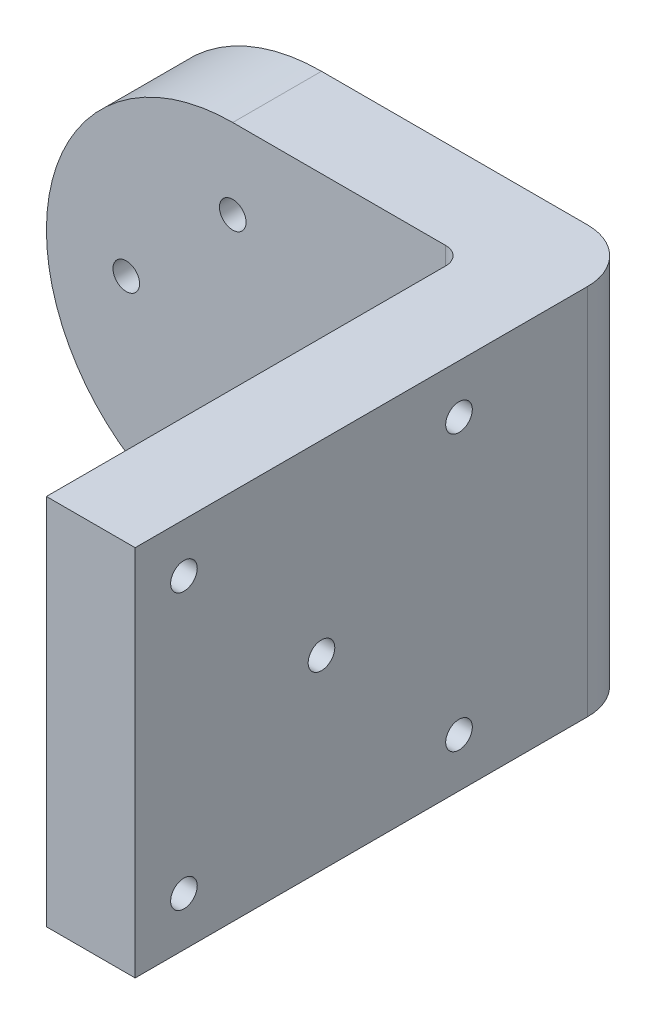
ISO-10303-21;
HEADER;
FILE_DESCRIPTION(('STEP AP214'),'2;1');
FILE_NAME('part.step','',(''),(''),'','','');
FILE_SCHEMA(('AUTOMOTIVE_DESIGN { 1 0 10303 214 1 1 1 1 }'));
ENDSEC;
DATA;
#1=APPLICATION_CONTEXT('core data for automotive mechanical design processes');
#2=APPLICATION_PROTOCOL_DEFINITION('international standard','automotive_design',2000,#1);
#3=PRODUCT_CONTEXT('',#1,'mechanical');
#4=PRODUCT('Part','Part','',(#3));
#5=PRODUCT_RELATED_PRODUCT_CATEGORY('part','',(#4));
#6=PRODUCT_DEFINITION_FORMATION('','',#4);
#7=PRODUCT_DEFINITION_CONTEXT('part definition',#1,'design');
#8=PRODUCT_DEFINITION('design','',#6,#7);
#9=PRODUCT_DEFINITION_SHAPE('','',#8);
#10=(LENGTH_UNIT() NAMED_UNIT(*) SI_UNIT(.MILLI.,.METRE.));
#11=(NAMED_UNIT(*) PLANE_ANGLE_UNIT() SI_UNIT($,.RADIAN.));
#12=(NAMED_UNIT(*) SI_UNIT($,.STERADIAN.) SOLID_ANGLE_UNIT());
#13=UNCERTAINTY_MEASURE_WITH_UNIT(LENGTH_MEASURE(1.E-05),#10,'distance_accuracy_value','');
#14=(GEOMETRIC_REPRESENTATION_CONTEXT(3) GLOBAL_UNCERTAINTY_ASSIGNED_CONTEXT((#13)) GLOBAL_UNIT_ASSIGNED_CONTEXT((#10,
#11,#12)) REPRESENTATION_CONTEXT('',''));
#15=CARTESIAN_POINT('',(0.,0.,0.));
#16=DIRECTION('',(0.,0.,1.));
#17=DIRECTION('',(1.,0.,0.));
#18=AXIS2_PLACEMENT_3D('',#15,#16,#17);
#19=CARTESIAN_POINT('',(0.,0.,10.));
#20=DIRECTION('',(0.,0.,-1.));
#21=DIRECTION('',(-1.,0.,0.));
#22=AXIS2_PLACEMENT_3D('',#19,#20,#21);
#23=CYLINDRICAL_SURFACE('',#22,21.);
#24=CARTESIAN_POINT('',(0.,0.,0.));
#25=DIRECTION('',(0.,0.,1.));
#26=DIRECTION('',(1.,0.,0.));
#27=AXIS2_PLACEMENT_3D('',#24,#25,#26);
#28=CIRCLE('',#27,21.);
#29=CARTESIAN_POINT('',(0.,21.,0.));
#30=VERTEX_POINT('',#29);
#31=CARTESIAN_POINT('',(0.,-21.,0.));
#32=VERTEX_POINT('',#31);
#33=EDGE_CURVE('E237',#30,#32,#28,.T.);
#34=ORIENTED_EDGE('',*,*,#33,.T.);
#35=DIRECTION('',(0.,0.,-1.));
#36=VECTOR('',#35,1.);
#37=CARTESIAN_POINT('',(0.,-21.,10.));
#38=LINE('',#37,#36);
#39=CARTESIAN_POINT('',(0.,-21.,10.));
#40=VERTEX_POINT('',#39);
#41=EDGE_CURVE('E248',#40,#32,#38,.T.);
#42=ORIENTED_EDGE('',*,*,#41,.F.);
#43=CARTESIAN_POINT('',(0.,0.,10.));
#44=DIRECTION('',(0.,0.,1.));
#45=DIRECTION('',(1.,0.,0.));
#46=AXIS2_PLACEMENT_3D('',#43,#44,#45);
#47=CIRCLE('',#46,21.);
#48=CARTESIAN_POINT('',(0.,21.,10.));
#49=VERTEX_POINT('',#48);
#50=EDGE_CURVE('E213',#49,#40,#47,.T.);
#51=ORIENTED_EDGE('',*,*,#50,.F.);
#52=DIRECTION('',(0.,0.,-1.));
#53=VECTOR('',#52,1.);
#54=CARTESIAN_POINT('',(0.,21.,10.));
#55=LINE('',#54,#53);
#56=EDGE_CURVE('E224',#49,#30,#55,.T.);
#57=ORIENTED_EDGE('',*,*,#56,.T.);
#58=EDGE_LOOP('',(#34,#42,#51,#57));
#59=FACE_BOUND('',#58,.T.);
#60=ADVANCED_FACE('F91',(#59),#23,.T.);
#61=CARTESIAN_POINT('',(0.,-21.,10.));
#62=DIRECTION('',(0.,1.,0.));
#63=DIRECTION('',(-1.,0.,0.));
#64=AXIS2_PLACEMENT_3D('',#61,#62,#63);
#65=PLANE('',#64);
#66=DIRECTION('',(1.,0.,0.));
#67=VECTOR('',#66,1.);
#68=CARTESIAN_POINT('',(0.,-21.,0.));
#69=LINE('',#68,#67);
#70=CARTESIAN_POINT('',(30.,-21.,0.));
#71=VERTEX_POINT('',#70);
#72=EDGE_CURVE('E241',#32,#71,#69,.T.);
#73=ORIENTED_EDGE('',*,*,#72,.T.);
#74=CARTESIAN_POINT('',(30.,-21.,6.));
#75=DIRECTION('',(0.,1.,0.));
#76=DIRECTION('',(-1.,0.,0.));
#77=AXIS2_PLACEMENT_3D('',#74,#75,#76);
#78=CIRCLE('',#77,6.);
#79=CARTESIAN_POINT('',(36.,-21.,6.));
#80=VERTEX_POINT('',#79);
#81=EDGE_CURVE('E12',#71,#80,#78,.F.);
#82=ORIENTED_EDGE('',*,*,#81,.T.);
#83=DIRECTION('',(0.,0.,1.));
#84=VECTOR('',#83,1.);
#85=CARTESIAN_POINT('',(36.,-21.,0.));
#86=LINE('',#85,#84);
#87=CARTESIAN_POINT('',(36.,-21.,57.));
#88=VERTEX_POINT('',#87);
#89=EDGE_CURVE('E156',#80,#88,#86,.T.);
#90=ORIENTED_EDGE('',*,*,#89,.T.);
#91=DIRECTION('',(-1.,0.,0.));
#92=VECTOR('',#91,1.);
#93=CARTESIAN_POINT('',(36.,-21.,57.));
#94=LINE('',#93,#92);
#95=CARTESIAN_POINT('',(26.,-21.,57.));
#96=VERTEX_POINT('',#95);
#97=EDGE_CURVE('E161',#88,#96,#94,.T.);
#98=ORIENTED_EDGE('',*,*,#97,.T.);
#99=DIRECTION('',(0.,0.,1.));
#100=VECTOR('',#99,1.);
#101=CARTESIAN_POINT('',(26.,-21.,0.));
#102=LINE('',#101,#100);
#103=CARTESIAN_POINT('',(26.,-21.,12.));
#104=VERTEX_POINT('',#103);
#105=EDGE_CURVE('E296',#104,#96,#102,.T.);
#106=ORIENTED_EDGE('',*,*,#105,.F.);
#107=CARTESIAN_POINT('',(24.,-21.,12.));
#108=DIRECTION('',(0.,1.,0.));
#109=DIRECTION('',(-1.,0.,0.));
#110=AXIS2_PLACEMENT_3D('',#107,#108,#109);
#111=CIRCLE('',#110,2.);
#112=CARTESIAN_POINT('',(24.,-21.,10.));
#113=VERTEX_POINT('',#112);
#114=EDGE_CURVE('E259',#104,#113,#111,.T.);
#115=ORIENTED_EDGE('',*,*,#114,.T.);
#116=DIRECTION('',(1.,0.,0.));
#117=VECTOR('',#116,1.);
#118=CARTESIAN_POINT('',(0.,-21.,10.));
#119=LINE('',#118,#117);
#120=EDGE_CURVE('E217',#40,#113,#119,.T.);
#121=ORIENTED_EDGE('',*,*,#120,.F.);
#122=ORIENTED_EDGE('',*,*,#41,.T.);
#123=EDGE_LOOP('',(#73,#82,#90,#98,#106,#115,#121,#122));
#124=FACE_BOUND('',#123,.T.);
#125=ADVANCED_FACE('F158',(#124),#65,.F.);
#126=CARTESIAN_POINT('',(-12.,0.,10.));
#127=DIRECTION('',(0.,0.,-1.));
#128=DIRECTION('',(-1.,0.,0.));
#129=AXIS2_PLACEMENT_3D('',#126,#127,#128);
#130=CYLINDRICAL_SURFACE('',#129,1.5);
#131=CARTESIAN_POINT('',(-12.,0.,10.));
#132=DIRECTION('',(0.,0.,1.));
#133=DIRECTION('',(1.,0.,0.));
#134=AXIS2_PLACEMENT_3D('',#131,#132,#133);
#135=CIRCLE('',#134,1.5);
#136=CARTESIAN_POINT('',(-10.5,0.,10.));
#137=VERTEX_POINT('',#136);
#138=EDGE_CURVE('E209',#137,#137,#135,.T.);
#139=ORIENTED_EDGE('',*,*,#138,.T.);
#140=EDGE_LOOP('',(#139));
#141=FACE_BOUND('',#140,.T.);
#142=CARTESIAN_POINT('',(-12.,0.,0.));
#143=DIRECTION('',(0.,0.,1.));
#144=DIRECTION('',(1.,0.,0.));
#145=AXIS2_PLACEMENT_3D('',#142,#143,#144);
#146=CIRCLE('',#145,1.5);
#147=CARTESIAN_POINT('',(-10.5,0.,0.));
#148=VERTEX_POINT('',#147);
#149=EDGE_CURVE('E233',#148,#148,#146,.T.);
#150=ORIENTED_EDGE('',*,*,#149,.F.);
#151=EDGE_LOOP('',(#150));
#152=FACE_BOUND('',#151,.T.);
#153=ADVANCED_FACE('F344',(#141,#152),#130,.F.);
#154=CARTESIAN_POINT('',(12.,0.,10.));
#155=DIRECTION('',(0.,0.,-1.));
#156=DIRECTION('',(-1.,0.,0.));
#157=AXIS2_PLACEMENT_3D('',#154,#155,#156);
#158=CYLINDRICAL_SURFACE('',#157,1.5);
#159=CARTESIAN_POINT('',(12.,0.,10.));
#160=DIRECTION('',(0.,0.,1.));
#161=DIRECTION('',(1.,0.,0.));
#162=AXIS2_PLACEMENT_3D('',#159,#160,#161);
#163=CIRCLE('',#162,1.5);
#164=CARTESIAN_POINT('',(13.5,0.,10.));
#165=VERTEX_POINT('',#164);
#166=EDGE_CURVE('E205',#165,#165,#163,.T.);
#167=ORIENTED_EDGE('',*,*,#166,.T.);
#168=EDGE_LOOP('',(#167));
#169=FACE_BOUND('',#168,.T.);
#170=CARTESIAN_POINT('',(12.,0.,0.));
#171=DIRECTION('',(0.,0.,1.));
#172=DIRECTION('',(1.,0.,0.));
#173=AXIS2_PLACEMENT_3D('',#170,#171,#172);
#174=CIRCLE('',#173,1.5);
#175=CARTESIAN_POINT('',(13.5,0.,0.));
#176=VERTEX_POINT('',#175);
#177=EDGE_CURVE('E229',#176,#176,#174,.T.);
#178=ORIENTED_EDGE('',*,*,#177,.F.);
#179=EDGE_LOOP('',(#178));
#180=FACE_BOUND('',#179,.T.);
#181=ADVANCED_FACE('F350',(#169,#180),#158,.F.);
#182=CARTESIAN_POINT('',(0.,12.,10.));
#183=DIRECTION('',(0.,0.,-1.));
#184=DIRECTION('',(-1.,0.,0.));
#185=AXIS2_PLACEMENT_3D('',#182,#183,#184);
#186=CYLINDRICAL_SURFACE('',#185,1.5);
#187=CARTESIAN_POINT('',(0.,12.,10.));
#188=DIRECTION('',(0.,0.,1.));
#189=DIRECTION('',(1.,0.,0.));
#190=AXIS2_PLACEMENT_3D('',#187,#188,#189);
#191=CIRCLE('',#190,1.5);
#192=CARTESIAN_POINT('',(1.5,12.,10.));
#193=VERTEX_POINT('',#192);
#194=EDGE_CURVE('E200',#193,#193,#191,.T.);
#195=ORIENTED_EDGE('',*,*,#194,.T.);
#196=EDGE_LOOP('',(#195));
#197=FACE_BOUND('',#196,.T.);
#198=CARTESIAN_POINT('',(0.,12.,0.));
#199=DIRECTION('',(0.,0.,1.));
#200=DIRECTION('',(1.,0.,0.));
#201=AXIS2_PLACEMENT_3D('',#198,#199,#200);
#202=CIRCLE('',#201,1.5);
#203=CARTESIAN_POINT('',(1.5,12.,0.));
#204=VERTEX_POINT('',#203);
#205=EDGE_CURVE('E190',#204,#204,#202,.T.);
#206=ORIENTED_EDGE('',*,*,#205,.F.);
#207=EDGE_LOOP('',(#206));
#208=FACE_BOUND('',#207,.T.);
#209=ADVANCED_FACE('F354',(#197,#208),#186,.F.);
#210=CARTESIAN_POINT('',(0.,-12.,10.));
#211=DIRECTION('',(0.,0.,-1.));
#212=DIRECTION('',(-1.,0.,0.));
#213=AXIS2_PLACEMENT_3D('',#210,#211,#212);
#214=CYLINDRICAL_SURFACE('',#213,1.5);
#215=CARTESIAN_POINT('',(0.,-12.,10.));
#216=DIRECTION('',(0.,0.,1.));
#217=DIRECTION('',(1.,0.,0.));
#218=AXIS2_PLACEMENT_3D('',#215,#216,#217);
#219=CIRCLE('',#218,1.5);
#220=CARTESIAN_POINT('',(1.5,-12.,10.));
#221=VERTEX_POINT('',#220);
#222=EDGE_CURVE('E196',#221,#221,#219,.T.);
#223=ORIENTED_EDGE('',*,*,#222,.T.);
#224=EDGE_LOOP('',(#223));
#225=FACE_BOUND('',#224,.T.);
#226=CARTESIAN_POINT('',(0.,-12.,0.));
#227=DIRECTION('',(0.,0.,1.));
#228=DIRECTION('',(1.,0.,0.));
#229=AXIS2_PLACEMENT_3D('',#226,#227,#228);
#230=CIRCLE('',#229,1.5);
#231=CARTESIAN_POINT('',(1.5,-12.,0.));
#232=VERTEX_POINT('',#231);
#233=EDGE_CURVE('E184',#232,#232,#230,.T.);
#234=ORIENTED_EDGE('',*,*,#233,.F.);
#235=EDGE_LOOP('',(#234));
#236=FACE_BOUND('',#235,.T.);
#237=ADVANCED_FACE('F358',(#225,#236),#214,.F.);
#238=CARTESIAN_POINT('',(0.,21.,10.));
#239=DIRECTION('',(0.,1.,0.));
#240=DIRECTION('',(-1.,0.,0.));
#241=AXIS2_PLACEMENT_3D('',#238,#239,#240);
#242=PLANE('',#241);
#243=DIRECTION('',(0.,0.,1.));
#244=VECTOR('',#243,1.);
#245=CARTESIAN_POINT('',(36.,21.,0.));
#246=LINE('',#245,#244);
#247=CARTESIAN_POINT('',(36.,21.,6.));
#248=VERTEX_POINT('',#247);
#249=CARTESIAN_POINT('',(36.,21.,57.));
#250=VERTEX_POINT('',#249);
#251=EDGE_CURVE('E168',#248,#250,#246,.T.);
#252=ORIENTED_EDGE('',*,*,#251,.F.);
#253=CARTESIAN_POINT('',(30.,21.,6.));
#254=DIRECTION('',(0.,1.,0.));
#255=DIRECTION('',(-1.,0.,0.));
#256=AXIS2_PLACEMENT_3D('',#253,#254,#255);
#257=CIRCLE('',#256,6.);
#258=CARTESIAN_POINT('',(30.,21.,0.));
#259=VERTEX_POINT('',#258);
#260=EDGE_CURVE('E114',#248,#259,#257,.T.);
#261=ORIENTED_EDGE('',*,*,#260,.T.);
#262=DIRECTION('',(1.,0.,0.));
#263=VECTOR('',#262,1.);
#264=CARTESIAN_POINT('',(0.,21.,0.));
#265=LINE('',#264,#263);
#266=EDGE_CURVE('E201',#30,#259,#265,.T.);
#267=ORIENTED_EDGE('',*,*,#266,.F.);
#268=ORIENTED_EDGE('',*,*,#56,.F.);
#269=DIRECTION('',(1.,0.,0.));
#270=VECTOR('',#269,1.);
#271=CARTESIAN_POINT('',(0.,21.,10.));
#272=LINE('',#271,#270);
#273=CARTESIAN_POINT('',(24.,21.,10.));
#274=VERTEX_POINT('',#273);
#275=EDGE_CURVE('E221',#49,#274,#272,.T.);
#276=ORIENTED_EDGE('',*,*,#275,.T.);
#277=CARTESIAN_POINT('',(24.,21.,12.));
#278=DIRECTION('',(0.,1.,0.));
#279=DIRECTION('',(-1.,0.,0.));
#280=AXIS2_PLACEMENT_3D('',#277,#278,#279);
#281=CIRCLE('',#280,2.);
#282=CARTESIAN_POINT('',(26.,21.,12.));
#283=VERTEX_POINT('',#282);
#284=EDGE_CURVE('E262',#274,#283,#281,.F.);
#285=ORIENTED_EDGE('',*,*,#284,.T.);
#286=DIRECTION('',(0.,0.,1.));
#287=VECTOR('',#286,1.);
#288=CARTESIAN_POINT('',(26.,21.,0.));
#289=LINE('',#288,#287);
#290=CARTESIAN_POINT('',(26.,21.,57.));
#291=VERTEX_POINT('',#290);
#292=EDGE_CURVE('E299',#283,#291,#289,.T.);
#293=ORIENTED_EDGE('',*,*,#292,.T.);
#294=DIRECTION('',(-1.,0.,0.));
#295=VECTOR('',#294,1.);
#296=CARTESIAN_POINT('',(36.,21.,57.));
#297=LINE('',#296,#295);
#298=EDGE_CURVE('E185',#250,#291,#297,.T.);
#299=ORIENTED_EDGE('',*,*,#298,.F.);
#300=EDGE_LOOP('',(#252,#261,#267,#268,#276,#285,#293,#299));
#301=FACE_BOUND('',#300,.T.);
#302=ADVANCED_FACE('F271',(#301),#242,.T.);
#303=CARTESIAN_POINT('',(0.,0.,10.));
#304=DIRECTION('',(0.,0.,1.));
#305=DIRECTION('',(1.,0.,0.));
#306=AXIS2_PLACEMENT_3D('',#303,#304,#305);
#307=PLANE('',#306);
#308=ORIENTED_EDGE('',*,*,#222,.F.);
#309=EDGE_LOOP('',(#308));
#310=FACE_BOUND('',#309,.T.);
#311=ORIENTED_EDGE('',*,*,#194,.F.);
#312=EDGE_LOOP('',(#311));
#313=FACE_BOUND('',#312,.T.);
#314=ORIENTED_EDGE('',*,*,#166,.F.);
#315=EDGE_LOOP('',(#314));
#316=FACE_BOUND('',#315,.T.);
#317=ORIENTED_EDGE('',*,*,#138,.F.);
#318=EDGE_LOOP('',(#317));
#319=FACE_BOUND('',#318,.T.);
#320=ORIENTED_EDGE('',*,*,#120,.T.);
#321=DIRECTION('',(0.,-1.,0.));
#322=VECTOR('',#321,1.);
#323=CARTESIAN_POINT('',(24.,0.,10.));
#324=LINE('',#323,#322);
#325=EDGE_CURVE('E256',#113,#274,#324,.F.);
#326=ORIENTED_EDGE('',*,*,#325,.T.);
#327=ORIENTED_EDGE('',*,*,#275,.F.);
#328=ORIENTED_EDGE('',*,*,#50,.T.);
#329=EDGE_LOOP('',(#320,#326,#327,#328));
#330=FACE_BOUND('',#329,.T.);
#331=ADVANCED_FACE('F365',(#310,#313,#316,#319,#330),#307,.T.);
#332=CARTESIAN_POINT('',(0.,0.,0.));
#333=DIRECTION('',(0.,0.,1.));
#334=DIRECTION('',(1.,0.,0.));
#335=AXIS2_PLACEMENT_3D('',#332,#333,#334);
#336=PLANE('',#335);
#337=ORIENTED_EDGE('',*,*,#233,.T.);
#338=EDGE_LOOP('',(#337));
#339=FACE_BOUND('',#338,.T.);
#340=ORIENTED_EDGE('',*,*,#205,.T.);
#341=EDGE_LOOP('',(#340));
#342=FACE_BOUND('',#341,.T.);
#343=ORIENTED_EDGE('',*,*,#177,.T.);
#344=EDGE_LOOP('',(#343));
#345=FACE_BOUND('',#344,.T.);
#346=ORIENTED_EDGE('',*,*,#149,.T.);
#347=EDGE_LOOP('',(#346));
#348=FACE_BOUND('',#347,.T.);
#349=ORIENTED_EDGE('',*,*,#266,.T.);
#350=DIRECTION('',(0.,1.,0.));
#351=VECTOR('',#350,1.);
#352=CARTESIAN_POINT('',(30.,-21.,0.));
#353=LINE('',#352,#351);
#354=EDGE_CURVE('E100',#259,#71,#353,.F.);
#355=ORIENTED_EDGE('',*,*,#354,.T.);
#356=ORIENTED_EDGE('',*,*,#72,.F.);
#357=ORIENTED_EDGE('',*,*,#33,.F.);
#358=EDGE_LOOP('',(#349,#355,#356,#357));
#359=FACE_BOUND('',#358,.T.);
#360=ADVANCED_FACE('F370',(#339,#342,#345,#348,#359),#336,.F.);
#361=CARTESIAN_POINT('',(26.,0.,0.));
#362=DIRECTION('',(1.,0.,0.));
#363=DIRECTION('',(0.,0.,-1.));
#364=AXIS2_PLACEMENT_3D('',#361,#362,#363);
#365=PLANE('',#364);
#366=CARTESIAN_POINT('',(26.,-15.5,51.5));
#367=DIRECTION('',(1.,0.,0.));
#368=DIRECTION('',(0.,0.,-1.));
#369=AXIS2_PLACEMENT_3D('',#366,#367,#368);
#370=CIRCLE('',#369,1.5);
#371=CARTESIAN_POINT('',(26.,-15.5,50.));
#372=VERTEX_POINT('',#371);
#373=EDGE_CURVE('E290',#372,#372,#370,.T.);
#374=ORIENTED_EDGE('',*,*,#373,.T.);
#375=EDGE_LOOP('',(#374));
#376=FACE_BOUND('',#375,.T.);
#377=CARTESIAN_POINT('',(26.,0.,36.));
#378=DIRECTION('',(1.,0.,0.));
#379=DIRECTION('',(0.,0.,-1.));
#380=AXIS2_PLACEMENT_3D('',#377,#378,#379);
#381=CIRCLE('',#380,1.5);
#382=CARTESIAN_POINT('',(26.,0.,34.5));
#383=VERTEX_POINT('',#382);
#384=EDGE_CURVE('E302',#383,#383,#381,.T.);
#385=ORIENTED_EDGE('',*,*,#384,.T.);
#386=EDGE_LOOP('',(#385));
#387=FACE_BOUND('',#386,.T.);
#388=CARTESIAN_POINT('',(26.,15.5,20.5));
#389=DIRECTION('',(1.,0.,0.));
#390=DIRECTION('',(0.,0.,-1.));
#391=AXIS2_PLACEMENT_3D('',#388,#389,#390);
#392=CIRCLE('',#391,1.5);
#393=CARTESIAN_POINT('',(26.,15.5,19.));
#394=VERTEX_POINT('',#393);
#395=EDGE_CURVE('E306',#394,#394,#392,.T.);
#396=ORIENTED_EDGE('',*,*,#395,.T.);
#397=EDGE_LOOP('',(#396));
#398=FACE_BOUND('',#397,.T.);
#399=CARTESIAN_POINT('',(26.,15.5,51.5));
#400=DIRECTION('',(1.,0.,0.));
#401=DIRECTION('',(0.,0.,-1.));
#402=AXIS2_PLACEMENT_3D('',#399,#400,#401);
#403=CIRCLE('',#402,1.5);
#404=CARTESIAN_POINT('',(26.,15.5,50.));
#405=VERTEX_POINT('',#404);
#406=EDGE_CURVE('E310',#405,#405,#403,.T.);
#407=ORIENTED_EDGE('',*,*,#406,.T.);
#408=EDGE_LOOP('',(#407));
#409=FACE_BOUND('',#408,.T.);
#410=CARTESIAN_POINT('',(26.,-15.5,20.5));
#411=DIRECTION('',(1.,0.,0.));
#412=DIRECTION('',(0.,0.,-1.));
#413=AXIS2_PLACEMENT_3D('',#410,#411,#412);
#414=CIRCLE('',#413,1.5);
#415=CARTESIAN_POINT('',(26.,-15.5,19.));
#416=VERTEX_POINT('',#415);
#417=EDGE_CURVE('E313',#416,#416,#414,.T.);
#418=ORIENTED_EDGE('',*,*,#417,.T.);
#419=EDGE_LOOP('',(#418));
#420=FACE_BOUND('',#419,.T.);
#421=ORIENTED_EDGE('',*,*,#292,.F.);
#422=DIRECTION('',(0.,-1.,0.));
#423=VECTOR('',#422,1.);
#424=CARTESIAN_POINT('',(26.,0.,12.));
#425=LINE('',#424,#423);
#426=EDGE_CURVE('E252',#283,#104,#425,.T.);
#427=ORIENTED_EDGE('',*,*,#426,.T.);
#428=ORIENTED_EDGE('',*,*,#105,.T.);
#429=DIRECTION('',(0.,-1.,0.));
#430=VECTOR('',#429,1.);
#431=CARTESIAN_POINT('',(26.,0.,57.));
#432=LINE('',#431,#430);
#433=EDGE_CURVE('E182',#291,#96,#432,.T.);
#434=ORIENTED_EDGE('',*,*,#433,.F.);
#435=EDGE_LOOP('',(#421,#427,#428,#434));
#436=FACE_BOUND('',#435,.T.);
#437=ADVANCED_FACE('F373',(#376,#387,#398,#409,#420,#436),#365,.F.);
#438=CARTESIAN_POINT('',(36.,0.,57.));
#439=DIRECTION('',(0.,0.,-1.));
#440=DIRECTION('',(-1.,0.,0.));
#441=AXIS2_PLACEMENT_3D('',#438,#439,#440);
#442=PLANE('',#441);
#443=ORIENTED_EDGE('',*,*,#433,.T.);
#444=ORIENTED_EDGE('',*,*,#97,.F.);
#445=DIRECTION('',(0.,-1.,0.));
#446=VECTOR('',#445,1.);
#447=CARTESIAN_POINT('',(36.,0.,57.));
#448=LINE('',#447,#446);
#449=EDGE_CURVE('E169',#250,#88,#448,.T.);
#450=ORIENTED_EDGE('',*,*,#449,.F.);
#451=ORIENTED_EDGE('',*,*,#298,.T.);
#452=EDGE_LOOP('',(#443,#444,#450,#451));
#453=FACE_BOUND('',#452,.T.);
#454=ADVANCED_FACE('F180',(#453),#442,.F.);
#455=CARTESIAN_POINT('',(36.,15.5,51.5));
#456=DIRECTION('',(-1.,0.,0.));
#457=DIRECTION('',(0.,0.,1.));
#458=AXIS2_PLACEMENT_3D('',#455,#456,#457);
#459=CYLINDRICAL_SURFACE('',#458,1.5);
#460=CARTESIAN_POINT('',(36.,15.5,51.5));
#461=DIRECTION('',(1.,0.,0.));
#462=DIRECTION('',(0.,0.,-1.));
#463=AXIS2_PLACEMENT_3D('',#460,#461,#462);
#464=CIRCLE('',#463,1.5);
#465=CARTESIAN_POINT('',(36.,15.5,50.));
#466=VERTEX_POINT('',#465);
#467=EDGE_CURVE('E283',#466,#466,#464,.T.);
#468=ORIENTED_EDGE('',*,*,#467,.T.);
#469=EDGE_LOOP('',(#468));
#470=FACE_BOUND('',#469,.T.);
#471=ORIENTED_EDGE('',*,*,#406,.F.);
#472=EDGE_LOOP('',(#471));
#473=FACE_BOUND('',#472,.T.);
#474=ADVANCED_FACE('F468',(#470,#473),#459,.F.);
#475=CARTESIAN_POINT('',(36.,15.5,20.5));
#476=DIRECTION('',(-1.,0.,0.));
#477=DIRECTION('',(0.,0.,1.));
#478=AXIS2_PLACEMENT_3D('',#475,#476,#477);
#479=CYLINDRICAL_SURFACE('',#478,1.5);
#480=CARTESIAN_POINT('',(36.,15.5,20.5));
#481=DIRECTION('',(1.,0.,0.));
#482=DIRECTION('',(0.,0.,-1.));
#483=AXIS2_PLACEMENT_3D('',#480,#481,#482);
#484=CIRCLE('',#483,1.5);
#485=CARTESIAN_POINT('',(36.,15.5,19.));
#486=VERTEX_POINT('',#485);
#487=EDGE_CURVE('E277',#486,#486,#484,.T.);
#488=ORIENTED_EDGE('',*,*,#487,.T.);
#489=EDGE_LOOP('',(#488));
#490=FACE_BOUND('',#489,.T.);
#491=ORIENTED_EDGE('',*,*,#395,.F.);
#492=EDGE_LOOP('',(#491));
#493=FACE_BOUND('',#492,.T.);
#494=ADVANCED_FACE('F459',(#490,#493),#479,.F.);
#495=CARTESIAN_POINT('',(36.,0.,36.));
#496=DIRECTION('',(-1.,0.,0.));
#497=DIRECTION('',(0.,0.,1.));
#498=AXIS2_PLACEMENT_3D('',#495,#496,#497);
#499=CYLINDRICAL_SURFACE('',#498,1.5);
#500=CARTESIAN_POINT('',(36.,0.,36.));
#501=DIRECTION('',(1.,0.,0.));
#502=DIRECTION('',(0.,0.,-1.));
#503=AXIS2_PLACEMENT_3D('',#500,#501,#502);
#504=CIRCLE('',#503,1.5);
#505=CARTESIAN_POINT('',(36.,0.,34.5));
#506=VERTEX_POINT('',#505);
#507=EDGE_CURVE('E273',#506,#506,#504,.T.);
#508=ORIENTED_EDGE('',*,*,#507,.T.);
#509=EDGE_LOOP('',(#508));
#510=FACE_BOUND('',#509,.T.);
#511=ORIENTED_EDGE('',*,*,#384,.F.);
#512=EDGE_LOOP('',(#511));
#513=FACE_BOUND('',#512,.T.);
#514=ADVANCED_FACE('F451',(#510,#513),#499,.F.);
#515=CARTESIAN_POINT('',(36.,-15.5,51.5));
#516=DIRECTION('',(-1.,0.,0.));
#517=DIRECTION('',(0.,0.,1.));
#518=AXIS2_PLACEMENT_3D('',#515,#516,#517);
#519=CYLINDRICAL_SURFACE('',#518,1.5);
#520=CARTESIAN_POINT('',(36.,-15.5,51.5));
#521=DIRECTION('',(1.,0.,0.));
#522=DIRECTION('',(0.,0.,-1.));
#523=AXIS2_PLACEMENT_3D('',#520,#521,#522);
#524=CIRCLE('',#523,1.5);
#525=CARTESIAN_POINT('',(36.,-15.5,50.));
#526=VERTEX_POINT('',#525);
#527=EDGE_CURVE('E178',#526,#526,#524,.T.);
#528=ORIENTED_EDGE('',*,*,#527,.T.);
#529=EDGE_LOOP('',(#528));
#530=FACE_BOUND('',#529,.T.);
#531=ORIENTED_EDGE('',*,*,#373,.F.);
#532=EDGE_LOOP('',(#531));
#533=FACE_BOUND('',#532,.T.);
#534=ADVANCED_FACE('F323',(#530,#533),#519,.F.);
#535=CARTESIAN_POINT('',(36.,-15.5,20.5));
#536=DIRECTION('',(-1.,0.,0.));
#537=DIRECTION('',(0.,0.,1.));
#538=AXIS2_PLACEMENT_3D('',#535,#536,#537);
#539=CYLINDRICAL_SURFACE('',#538,1.5);
#540=CARTESIAN_POINT('',(36.,-15.5,20.5));
#541=DIRECTION('',(1.,0.,0.));
#542=DIRECTION('',(0.,0.,-1.));
#543=AXIS2_PLACEMENT_3D('',#540,#541,#542);
#544=CIRCLE('',#543,1.5);
#545=CARTESIAN_POINT('',(36.,-15.5,19.));
#546=VERTEX_POINT('',#545);
#547=EDGE_CURVE('E192',#546,#546,#544,.T.);
#548=ORIENTED_EDGE('',*,*,#547,.T.);
#549=EDGE_LOOP('',(#548));
#550=FACE_BOUND('',#549,.T.);
#551=ORIENTED_EDGE('',*,*,#417,.F.);
#552=EDGE_LOOP('',(#551));
#553=FACE_BOUND('',#552,.T.);
#554=ADVANCED_FACE('F328',(#550,#553),#539,.F.);
#555=CARTESIAN_POINT('',(36.,0.,0.));
#556=DIRECTION('',(1.,0.,0.));
#557=DIRECTION('',(0.,0.,-1.));
#558=AXIS2_PLACEMENT_3D('',#555,#556,#557);
#559=PLANE('',#558);
#560=ORIENTED_EDGE('',*,*,#527,.F.);
#561=EDGE_LOOP('',(#560));
#562=FACE_BOUND('',#561,.T.);
#563=ORIENTED_EDGE('',*,*,#89,.F.);
#564=DIRECTION('',(0.,1.,0.));
#565=VECTOR('',#564,1.);
#566=CARTESIAN_POINT('',(36.,21.,6.));
#567=LINE('',#566,#565);
#568=EDGE_CURVE('E265',#80,#248,#567,.T.);
#569=ORIENTED_EDGE('',*,*,#568,.T.);
#570=ORIENTED_EDGE('',*,*,#251,.T.);
#571=ORIENTED_EDGE('',*,*,#449,.T.);
#572=EDGE_LOOP('',(#563,#569,#570,#571));
#573=FACE_BOUND('',#572,.T.);
#574=ORIENTED_EDGE('',*,*,#507,.F.);
#575=EDGE_LOOP('',(#574));
#576=FACE_BOUND('',#575,.T.);
#577=ORIENTED_EDGE('',*,*,#487,.F.);
#578=EDGE_LOOP('',(#577));
#579=FACE_BOUND('',#578,.T.);
#580=ORIENTED_EDGE('',*,*,#467,.F.);
#581=EDGE_LOOP('',(#580));
#582=FACE_BOUND('',#581,.T.);
#583=ORIENTED_EDGE('',*,*,#547,.F.);
#584=EDGE_LOOP('',(#583));
#585=FACE_BOUND('',#584,.T.);
#586=ADVANCED_FACE('F172',(#562,#573,#576,#579,#582,#585),#559,.T.);
#587=CARTESIAN_POINT('',(24.,0.,12.));
#588=DIRECTION('',(0.,-1.,0.));
#589=DIRECTION('',(0.,0.,-1.));
#590=AXIS2_PLACEMENT_3D('',#587,#588,#589);
#591=CYLINDRICAL_SURFACE('',#590,2.);
#592=ORIENTED_EDGE('',*,*,#284,.F.);
#593=ORIENTED_EDGE('',*,*,#325,.F.);
#594=ORIENTED_EDGE('',*,*,#114,.F.);
#595=ORIENTED_EDGE('',*,*,#426,.F.);
#596=EDGE_LOOP('',(#592,#593,#594,#595));
#597=FACE_BOUND('',#596,.T.);
#598=ADVANCED_FACE('F327',(#597),#591,.F.);
#599=CARTESIAN_POINT('',(30.,0.,6.));
#600=DIRECTION('',(0.,-1.,0.));
#601=DIRECTION('',(0.,0.,-1.));
#602=AXIS2_PLACEMENT_3D('',#599,#600,#601);
#603=CYLINDRICAL_SURFACE('',#602,6.);
#604=ORIENTED_EDGE('',*,*,#81,.F.);
#605=ORIENTED_EDGE('',*,*,#354,.F.);
#606=ORIENTED_EDGE('',*,*,#260,.F.);
#607=ORIENTED_EDGE('',*,*,#568,.F.);
#608=EDGE_LOOP('',(#604,#605,#606,#607));
#609=FACE_BOUND('',#608,.T.);
#610=ADVANCED_FACE('F93',(#609),#603,.T.);
#611=CLOSED_SHELL('',(#60,#125,#153,#181,#209,#237,#302,#331,#360,#437,#454,#474,#494,#514,#534,
#554,#586,#598,#610));
#612=MANIFOLD_SOLID_BREP('B2',#611);
#613=ADVANCED_BREP_SHAPE_REPRESENTATION('',(#18,#612),#14);
#614=SHAPE_DEFINITION_REPRESENTATION(#9,#613);
ENDSEC;
END-ISO-10303-21;
